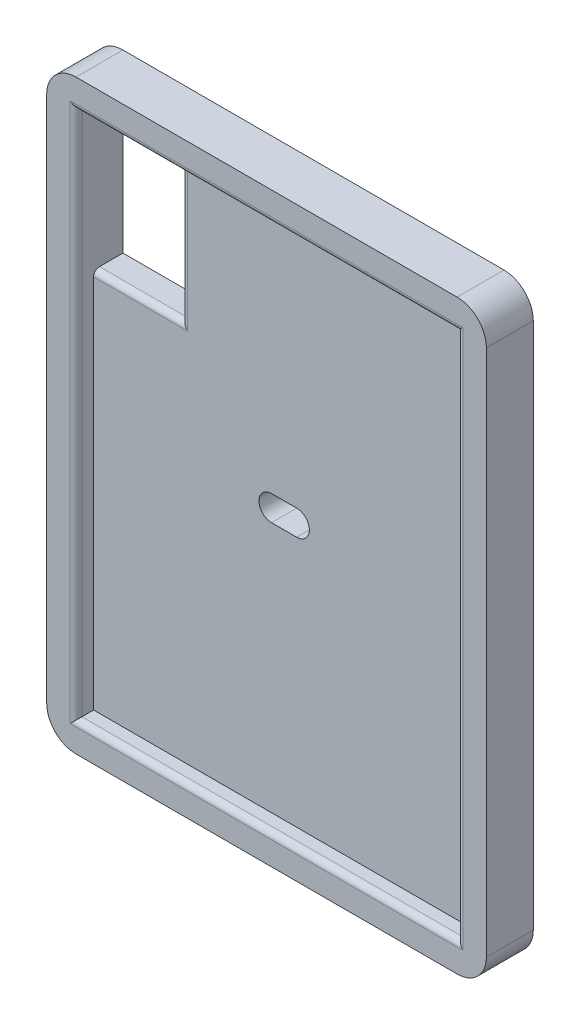
ISO-10303-21;
HEADER;
FILE_DESCRIPTION(('STEP AP214'),'2;1');
FILE_NAME('part.step','',(''),(''),'','','');
FILE_SCHEMA(('AUTOMOTIVE_DESIGN { 1 0 10303 214 1 1 1 1 }'));
ENDSEC;
DATA;
#1=APPLICATION_CONTEXT('core data for automotive mechanical design processes');
#2=APPLICATION_PROTOCOL_DEFINITION('international standard','automotive_design',2000,#1);
#3=PRODUCT_CONTEXT('',#1,'mechanical');
#4=PRODUCT('Part','Part','',(#3));
#5=PRODUCT_RELATED_PRODUCT_CATEGORY('part','',(#4));
#6=PRODUCT_DEFINITION_FORMATION('','',#4);
#7=PRODUCT_DEFINITION_CONTEXT('part definition',#1,'design');
#8=PRODUCT_DEFINITION('design','',#6,#7);
#9=PRODUCT_DEFINITION_SHAPE('','',#8);
#10=(LENGTH_UNIT() NAMED_UNIT(*) SI_UNIT(.MILLI.,.METRE.));
#11=(NAMED_UNIT(*) PLANE_ANGLE_UNIT() SI_UNIT($,.RADIAN.));
#12=(NAMED_UNIT(*) SI_UNIT($,.STERADIAN.) SOLID_ANGLE_UNIT());
#13=UNCERTAINTY_MEASURE_WITH_UNIT(LENGTH_MEASURE(1.E-05),#10,'distance_accuracy_value','');
#14=(GEOMETRIC_REPRESENTATION_CONTEXT(3) GLOBAL_UNCERTAINTY_ASSIGNED_CONTEXT((#13)) GLOBAL_UNIT_ASSIGNED_CONTEXT((#10,
#11,#12)) REPRESENTATION_CONTEXT('',''));
#15=CARTESIAN_POINT('',(0.,0.,0.));
#16=DIRECTION('',(0.,0.,1.));
#17=DIRECTION('',(1.,0.,0.));
#18=AXIS2_PLACEMENT_3D('',#15,#16,#17);
#19=CARTESIAN_POINT('',(0.,0.,5.));
#20=DIRECTION('',(0.,0.,-1.));
#21=DIRECTION('',(-1.,0.,0.));
#22=AXIS2_PLACEMENT_3D('',#19,#20,#21);
#23=PLANE('',#22);
#24=DIRECTION('',(1.,0.,0.));
#25=VECTOR('',#24,1.);
#26=CARTESIAN_POINT('',(-2.15,-2.15,5.));
#27=LINE('',#26,#25);
#28=CARTESIAN_POINT('',(-2.15,-2.15,5.));
#29=VERTEX_POINT('',#28);
#30=CARTESIAN_POINT('',(2.15,-2.15,5.));
#31=VERTEX_POINT('',#30);
#32=EDGE_CURVE('E231',#29,#31,#27,.T.);
#33=ORIENTED_EDGE('',*,*,#32,.F.);
#34=CARTESIAN_POINT('',(-2.15,0.,5.));
#35=DIRECTION('',(0.,0.,1.));
#36=DIRECTION('',(1.,0.,0.));
#37=AXIS2_PLACEMENT_3D('',#34,#35,#36);
#38=CIRCLE('',#37,2.15);
#39=CARTESIAN_POINT('',(-2.15,2.15,5.));
#40=VERTEX_POINT('',#39);
#41=EDGE_CURVE('E228',#40,#29,#38,.T.);
#42=ORIENTED_EDGE('',*,*,#41,.F.);
#43=DIRECTION('',(-1.,0.,0.));
#44=VECTOR('',#43,1.);
#45=CARTESIAN_POINT('',(-2.15,2.15,5.));
#46=LINE('',#45,#44);
#47=CARTESIAN_POINT('',(2.15,2.15,5.));
#48=VERTEX_POINT('',#47);
#49=EDGE_CURVE('E260',#48,#40,#46,.T.);
#50=ORIENTED_EDGE('',*,*,#49,.F.);
#51=CARTESIAN_POINT('',(2.15,0.,5.));
#52=DIRECTION('',(0.,0.,1.));
#53=DIRECTION('',(1.,0.,0.));
#54=AXIS2_PLACEMENT_3D('',#51,#52,#53);
#55=CIRCLE('',#54,2.15);
#56=EDGE_CURVE('E264',#31,#48,#55,.T.);
#57=ORIENTED_EDGE('',*,*,#56,.F.);
#58=EDGE_LOOP('',(#33,#42,#50,#57));
#59=FACE_BOUND('',#58,.T.);
#60=DIRECTION('',(-1.,0.,0.));
#61=VECTOR('',#60,1.);
#62=CARTESIAN_POINT('',(-32.5,45.,5.));
#63=LINE('',#62,#61);
#64=CARTESIAN_POINT('',(32.5,45.,5.));
#65=VERTEX_POINT('',#64);
#66=CARTESIAN_POINT('',(-16.5,45.,5.));
#67=VERTEX_POINT('',#66);
#68=EDGE_CURVE('E289',#65,#67,#63,.T.);
#69=ORIENTED_EDGE('',*,*,#68,.T.);
#70=DIRECTION('',(0.,1.,0.));
#71=VECTOR('',#70,1.);
#72=CARTESIAN_POINT('',(-16.5,0.,5.));
#73=LINE('',#72,#71);
#74=CARTESIAN_POINT('',(-16.5,19.,5.));
#75=VERTEX_POINT('',#74);
#76=EDGE_CURVE('E404',#67,#75,#73,.F.);
#77=ORIENTED_EDGE('',*,*,#76,.T.);
#78=DIRECTION('',(1.,0.,0.));
#79=VECTOR('',#78,1.);
#80=CARTESIAN_POINT('',(0.,19.,5.));
#81=LINE('',#80,#79);
#82=CARTESIAN_POINT('',(-32.5,19.,5.));
#83=VERTEX_POINT('',#82);
#84=EDGE_CURVE('E401',#75,#83,#81,.F.);
#85=ORIENTED_EDGE('',*,*,#84,.T.);
#86=DIRECTION('',(0.,-1.,0.));
#87=VECTOR('',#86,1.);
#88=CARTESIAN_POINT('',(-32.5,-45.,5.));
#89=LINE('',#88,#87);
#90=CARTESIAN_POINT('',(-32.5,-45.,5.));
#91=VERTEX_POINT('',#90);
#92=EDGE_CURVE('E293',#83,#91,#89,.T.);
#93=ORIENTED_EDGE('',*,*,#92,.T.);
#94=DIRECTION('',(1.,0.,0.));
#95=VECTOR('',#94,1.);
#96=CARTESIAN_POINT('',(-32.5,-45.,5.));
#97=LINE('',#96,#95);
#98=CARTESIAN_POINT('',(32.5,-45.,5.));
#99=VERTEX_POINT('',#98);
#100=EDGE_CURVE('E297',#91,#99,#97,.T.);
#101=ORIENTED_EDGE('',*,*,#100,.T.);
#102=DIRECTION('',(0.,1.,0.));
#103=VECTOR('',#102,1.);
#104=CARTESIAN_POINT('',(32.5,-45.,5.));
#105=LINE('',#104,#103);
#106=EDGE_CURVE('E242',#99,#65,#105,.T.);
#107=ORIENTED_EDGE('',*,*,#106,.T.);
#108=EDGE_LOOP('',(#69,#77,#85,#93,#101,#107));
#109=FACE_BOUND('',#108,.T.);
#110=ADVANCED_FACE('F45',(#59,#109),#23,.F.);
#111=CARTESIAN_POINT('',(37.5,50.,5.));
#112=DIRECTION('',(0.,-1.,0.));
#113=DIRECTION('',(0.,0.,-1.));
#114=AXIS2_PLACEMENT_3D('',#111,#112,#113);
#115=PLANE('',#114);
#116=DIRECTION('',(-1.,0.,0.));
#117=VECTOR('',#116,1.);
#118=CARTESIAN_POINT('',(37.5,50.,0.));
#119=LINE('',#118,#117);
#120=CARTESIAN_POINT('',(32.5,50.,0.));
#121=VERTEX_POINT('',#120);
#122=CARTESIAN_POINT('',(-32.5,50.,0.));
#123=VERTEX_POINT('',#122);
#124=EDGE_CURVE('E329',#121,#123,#119,.T.);
#125=ORIENTED_EDGE('',*,*,#124,.T.);
#126=DIRECTION('',(0.,0.,-1.));
#127=VECTOR('',#126,1.);
#128=CARTESIAN_POINT('',(-32.5,50.,5.));
#129=LINE('',#128,#127);
#130=CARTESIAN_POINT('',(-32.5,50.,8.));
#131=VERTEX_POINT('',#130);
#132=EDGE_CURVE('E368',#123,#131,#129,.F.);
#133=ORIENTED_EDGE('',*,*,#132,.T.);
#134=DIRECTION('',(-1.,0.,0.));
#135=VECTOR('',#134,1.);
#136=CARTESIAN_POINT('',(-37.5,50.,8.));
#137=LINE('',#136,#135);
#138=CARTESIAN_POINT('',(32.5,50.,8.));
#139=VERTEX_POINT('',#138);
#140=EDGE_CURVE('E325',#139,#131,#137,.T.);
#141=ORIENTED_EDGE('',*,*,#140,.F.);
#142=DIRECTION('',(0.,0.,-1.));
#143=VECTOR('',#142,1.);
#144=CARTESIAN_POINT('',(32.5,50.,5.));
#145=LINE('',#144,#143);
#146=EDGE_CURVE('E364',#139,#121,#145,.T.);
#147=ORIENTED_EDGE('',*,*,#146,.T.);
#148=EDGE_LOOP('',(#125,#133,#141,#147));
#149=FACE_BOUND('',#148,.T.);
#150=ADVANCED_FACE('F494',(#149),#115,.F.);
#151=CARTESIAN_POINT('',(-37.5,-50.,5.));
#152=DIRECTION('',(1.,0.,0.));
#153=DIRECTION('',(0.,0.,-1.));
#154=AXIS2_PLACEMENT_3D('',#151,#152,#153);
#155=PLANE('',#154);
#156=DIRECTION('',(0.,-1.,0.));
#157=VECTOR('',#156,1.);
#158=CARTESIAN_POINT('',(-37.5,-50.,8.));
#159=LINE('',#158,#157);
#160=CARTESIAN_POINT('',(-37.5,45.,8.));
#161=VERTEX_POINT('',#160);
#162=CARTESIAN_POINT('',(-37.5,-45.,8.));
#163=VERTEX_POINT('',#162);
#164=EDGE_CURVE('E313',#161,#163,#159,.T.);
#165=ORIENTED_EDGE('',*,*,#164,.F.);
#166=DIRECTION('',(0.,0.,-1.));
#167=VECTOR('',#166,1.);
#168=CARTESIAN_POINT('',(-37.5,45.,5.));
#169=LINE('',#168,#167);
#170=CARTESIAN_POINT('',(-37.5,45.,0.));
#171=VERTEX_POINT('',#170);
#172=EDGE_CURVE('E348',#161,#171,#169,.T.);
#173=ORIENTED_EDGE('',*,*,#172,.T.);
#174=DIRECTION('',(0.,-1.,0.));
#175=VECTOR('',#174,1.);
#176=CARTESIAN_POINT('',(-37.5,-50.,0.));
#177=LINE('',#176,#175);
#178=CARTESIAN_POINT('',(-37.5,-45.,0.));
#179=VERTEX_POINT('',#178);
#180=EDGE_CURVE('E333',#171,#179,#177,.T.);
#181=ORIENTED_EDGE('',*,*,#180,.T.);
#182=DIRECTION('',(0.,0.,-1.));
#183=VECTOR('',#182,1.);
#184=CARTESIAN_POINT('',(-37.5,-45.,5.));
#185=LINE('',#184,#183);
#186=EDGE_CURVE('E345',#179,#163,#185,.F.);
#187=ORIENTED_EDGE('',*,*,#186,.T.);
#188=EDGE_LOOP('',(#165,#173,#181,#187));
#189=FACE_BOUND('',#188,.T.);
#190=ADVANCED_FACE('F502',(#189),#155,.F.);
#191=CARTESIAN_POINT('',(37.5,-50.,5.));
#192=DIRECTION('',(0.,1.,0.));
#193=DIRECTION('',(0.,0.,1.));
#194=AXIS2_PLACEMENT_3D('',#191,#192,#193);
#195=PLANE('',#194);
#196=DIRECTION('',(1.,0.,0.));
#197=VECTOR('',#196,1.);
#198=CARTESIAN_POINT('',(37.5,-50.,0.));
#199=LINE('',#198,#197);
#200=CARTESIAN_POINT('',(-32.5,-50.,0.));
#201=VERTEX_POINT('',#200);
#202=CARTESIAN_POINT('',(32.5,-50.,0.));
#203=VERTEX_POINT('',#202);
#204=EDGE_CURVE('E337',#201,#203,#199,.T.);
#205=ORIENTED_EDGE('',*,*,#204,.T.);
#206=DIRECTION('',(0.,0.,-1.));
#207=VECTOR('',#206,1.);
#208=CARTESIAN_POINT('',(32.5,-50.,5.));
#209=LINE('',#208,#207);
#210=CARTESIAN_POINT('',(32.5,-50.,8.));
#211=VERTEX_POINT('',#210);
#212=EDGE_CURVE('E394',#203,#211,#209,.F.);
#213=ORIENTED_EDGE('',*,*,#212,.T.);
#214=DIRECTION('',(1.,0.,0.));
#215=VECTOR('',#214,1.);
#216=CARTESIAN_POINT('',(37.5,-50.,8.));
#217=LINE('',#216,#215);
#218=CARTESIAN_POINT('',(-32.5,-50.,8.));
#219=VERTEX_POINT('',#218);
#220=EDGE_CURVE('E317',#219,#211,#217,.T.);
#221=ORIENTED_EDGE('',*,*,#220,.F.);
#222=DIRECTION('',(0.,0.,-1.));
#223=VECTOR('',#222,1.);
#224=CARTESIAN_POINT('',(-32.5,-50.,5.));
#225=LINE('',#224,#223);
#226=EDGE_CURVE('E390',#219,#201,#225,.T.);
#227=ORIENTED_EDGE('',*,*,#226,.T.);
#228=EDGE_LOOP('',(#205,#213,#221,#227));
#229=FACE_BOUND('',#228,.T.);
#230=ADVANCED_FACE('F513',(#229),#195,.F.);
#231=CARTESIAN_POINT('',(37.5,-50.,5.));
#232=DIRECTION('',(-1.,0.,0.));
#233=DIRECTION('',(0.,0.,1.));
#234=AXIS2_PLACEMENT_3D('',#231,#232,#233);
#235=PLANE('',#234);
#236=DIRECTION('',(0.,1.,0.));
#237=VECTOR('',#236,1.);
#238=CARTESIAN_POINT('',(37.5,-50.,0.));
#239=LINE('',#238,#237);
#240=CARTESIAN_POINT('',(37.5,-45.,0.));
#241=VERTEX_POINT('',#240);
#242=CARTESIAN_POINT('',(37.5,45.,0.));
#243=VERTEX_POINT('',#242);
#244=EDGE_CURVE('E341',#241,#243,#239,.T.);
#245=ORIENTED_EDGE('',*,*,#244,.T.);
#246=DIRECTION('',(0.,0.,-1.));
#247=VECTOR('',#246,1.);
#248=CARTESIAN_POINT('',(37.5,45.,5.));
#249=LINE('',#248,#247);
#250=CARTESIAN_POINT('',(37.5,45.,8.));
#251=VERTEX_POINT('',#250);
#252=EDGE_CURVE('E387',#243,#251,#249,.F.);
#253=ORIENTED_EDGE('',*,*,#252,.T.);
#254=DIRECTION('',(0.,1.,0.));
#255=VECTOR('',#254,1.);
#256=CARTESIAN_POINT('',(37.5,50.,8.));
#257=LINE('',#256,#255);
#258=CARTESIAN_POINT('',(37.5,-45.,8.));
#259=VERTEX_POINT('',#258);
#260=EDGE_CURVE('E321',#259,#251,#257,.T.);
#261=ORIENTED_EDGE('',*,*,#260,.F.);
#262=DIRECTION('',(0.,0.,-1.));
#263=VECTOR('',#262,1.);
#264=CARTESIAN_POINT('',(37.5,-45.,5.));
#265=LINE('',#264,#263);
#266=EDGE_CURVE('E383',#259,#241,#265,.T.);
#267=ORIENTED_EDGE('',*,*,#266,.T.);
#268=EDGE_LOOP('',(#245,#253,#261,#267));
#269=FACE_BOUND('',#268,.T.);
#270=ADVANCED_FACE('F510',(#269),#235,.F.);
#271=CARTESIAN_POINT('',(0.,0.,0.));
#272=DIRECTION('',(0.,0.,-1.));
#273=DIRECTION('',(-1.,0.,0.));
#274=AXIS2_PLACEMENT_3D('',#271,#272,#273);
#275=PLANE('',#274);
#276=DIRECTION('',(0.,-1.,0.));
#277=VECTOR('',#276,1.);
#278=CARTESIAN_POINT('',(-32.5,45.,0.));
#279=LINE('',#278,#277);
#280=CARTESIAN_POINT('',(-32.5,45.,0.));
#281=VERTEX_POINT('',#280);
#282=CARTESIAN_POINT('',(-32.5,20.,0.));
#283=VERTEX_POINT('',#282);
#284=EDGE_CURVE('E204',#281,#283,#279,.T.);
#285=ORIENTED_EDGE('',*,*,#284,.T.);
#286=DIRECTION('',(1.,0.,0.));
#287=VECTOR('',#286,1.);
#288=CARTESIAN_POINT('',(-32.5,20.,0.));
#289=LINE('',#288,#287);
#290=CARTESIAN_POINT('',(-17.5,20.,0.));
#291=VERTEX_POINT('',#290);
#292=EDGE_CURVE('E216',#283,#291,#289,.T.);
#293=ORIENTED_EDGE('',*,*,#292,.T.);
#294=DIRECTION('',(0.,1.,0.));
#295=VECTOR('',#294,1.);
#296=CARTESIAN_POINT('',(-17.5,45.,0.));
#297=LINE('',#296,#295);
#298=CARTESIAN_POINT('',(-17.5,45.,0.));
#299=VERTEX_POINT('',#298);
#300=EDGE_CURVE('E222',#291,#299,#297,.T.);
#301=ORIENTED_EDGE('',*,*,#300,.T.);
#302=DIRECTION('',(-1.,0.,0.));
#303=VECTOR('',#302,1.);
#304=CARTESIAN_POINT('',(-32.5,45.,0.));
#305=LINE('',#304,#303);
#306=EDGE_CURVE('E212',#299,#281,#305,.T.);
#307=ORIENTED_EDGE('',*,*,#306,.T.);
#308=EDGE_LOOP('',(#285,#293,#301,#307));
#309=FACE_BOUND('',#308,.T.);
#310=CARTESIAN_POINT('',(-2.15,0.,0.));
#311=DIRECTION('',(0.,0.,1.));
#312=DIRECTION('',(1.,0.,0.));
#313=AXIS2_PLACEMENT_3D('',#310,#311,#312);
#314=CIRCLE('',#313,2.15);
#315=CARTESIAN_POINT('',(-2.15,2.15,0.));
#316=VERTEX_POINT('',#315);
#317=CARTESIAN_POINT('',(-2.15,-2.15,0.));
#318=VERTEX_POINT('',#317);
#319=EDGE_CURVE('E265',#316,#318,#314,.T.);
#320=ORIENTED_EDGE('',*,*,#319,.T.);
#321=DIRECTION('',(1.,0.,0.));
#322=VECTOR('',#321,1.);
#323=CARTESIAN_POINT('',(-2.15,-2.15,0.));
#324=LINE('',#323,#322);
#325=CARTESIAN_POINT('',(2.15,-2.15,0.));
#326=VERTEX_POINT('',#325);
#327=EDGE_CURVE('E279',#318,#326,#324,.T.);
#328=ORIENTED_EDGE('',*,*,#327,.T.);
#329=CARTESIAN_POINT('',(2.15,0.,0.));
#330=DIRECTION('',(0.,0.,1.));
#331=DIRECTION('',(1.,0.,0.));
#332=AXIS2_PLACEMENT_3D('',#329,#330,#331);
#333=CIRCLE('',#332,2.15);
#334=CARTESIAN_POINT('',(2.15,2.15,0.));
#335=VERTEX_POINT('',#334);
#336=EDGE_CURVE('E275',#326,#335,#333,.T.);
#337=ORIENTED_EDGE('',*,*,#336,.T.);
#338=DIRECTION('',(-1.,0.,0.));
#339=VECTOR('',#338,1.);
#340=CARTESIAN_POINT('',(-2.15,2.15,0.));
#341=LINE('',#340,#339);
#342=EDGE_CURVE('E249',#335,#316,#341,.T.);
#343=ORIENTED_EDGE('',*,*,#342,.T.);
#344=EDGE_LOOP('',(#320,#328,#337,#343));
#345=FACE_BOUND('',#344,.T.);
#346=ORIENTED_EDGE('',*,*,#180,.F.);
#347=CARTESIAN_POINT('',(-32.5,45.,0.));
#348=DIRECTION('',(0.,0.,-1.));
#349=DIRECTION('',(-1.,0.,0.));
#350=AXIS2_PLACEMENT_3D('',#347,#348,#349);
#351=CIRCLE('',#350,5.);
#352=EDGE_CURVE('E361',#171,#123,#351,.T.);
#353=ORIENTED_EDGE('',*,*,#352,.T.);
#354=ORIENTED_EDGE('',*,*,#124,.F.);
#355=CARTESIAN_POINT('',(32.5,45.,0.));
#356=DIRECTION('',(0.,0.,-1.));
#357=DIRECTION('',(-1.,0.,0.));
#358=AXIS2_PLACEMENT_3D('',#355,#356,#357);
#359=CIRCLE('',#358,5.);
#360=EDGE_CURVE('E358',#121,#243,#359,.T.);
#361=ORIENTED_EDGE('',*,*,#360,.T.);
#362=ORIENTED_EDGE('',*,*,#244,.F.);
#363=CARTESIAN_POINT('',(32.5,-45.,0.));
#364=DIRECTION('',(0.,0.,-1.));
#365=DIRECTION('',(-1.,0.,0.));
#366=AXIS2_PLACEMENT_3D('',#363,#364,#365);
#367=CIRCLE('',#366,5.);
#368=EDGE_CURVE('E355',#241,#203,#367,.T.);
#369=ORIENTED_EDGE('',*,*,#368,.T.);
#370=ORIENTED_EDGE('',*,*,#204,.F.);
#371=CARTESIAN_POINT('',(-32.5,-45.,0.));
#372=DIRECTION('',(0.,0.,-1.));
#373=DIRECTION('',(-1.,0.,0.));
#374=AXIS2_PLACEMENT_3D('',#371,#372,#373);
#375=CIRCLE('',#374,5.);
#376=EDGE_CURVE('E352',#201,#179,#375,.T.);
#377=ORIENTED_EDGE('',*,*,#376,.T.);
#378=EDGE_LOOP('',(#346,#353,#354,#361,#362,#369,#370,#377));
#379=FACE_BOUND('',#378,.T.);
#380=ADVANCED_FACE('F224',(#309,#345,#379),#275,.T.);
#381=CARTESIAN_POINT('',(0.,0.,8.));
#382=DIRECTION('',(0.,0.,-1.));
#383=DIRECTION('',(-1.,0.,0.));
#384=AXIS2_PLACEMENT_3D('',#381,#382,#383);
#385=PLANE('',#384);
#386=DIRECTION('',(0.,1.,0.));
#387=VECTOR('',#386,1.);
#388=CARTESIAN_POINT('',(33.5,-45.,8.));
#389=LINE('',#388,#387);
#390=CARTESIAN_POINT('',(33.5,46.,8.));
#391=VERTEX_POINT('',#390);
#392=CARTESIAN_POINT('',(33.5,-46.,8.));
#393=VERTEX_POINT('',#392);
#394=EDGE_CURVE('E414',#391,#393,#389,.F.);
#395=ORIENTED_EDGE('',*,*,#394,.T.);
#396=DIRECTION('',(1.,0.,0.));
#397=VECTOR('',#396,1.);
#398=CARTESIAN_POINT('',(-32.5,-46.,8.));
#399=LINE('',#398,#397);
#400=CARTESIAN_POINT('',(-33.5,-46.,8.));
#401=VERTEX_POINT('',#400);
#402=EDGE_CURVE('E423',#393,#401,#399,.F.);
#403=ORIENTED_EDGE('',*,*,#402,.T.);
#404=DIRECTION('',(0.,-1.,0.));
#405=VECTOR('',#404,1.);
#406=CARTESIAN_POINT('',(-33.5,45.,8.));
#407=LINE('',#406,#405);
#408=CARTESIAN_POINT('',(-33.5,46.,8.));
#409=VERTEX_POINT('',#408);
#410=EDGE_CURVE('E420',#401,#409,#407,.F.);
#411=ORIENTED_EDGE('',*,*,#410,.T.);
#412=DIRECTION('',(-1.,0.,0.));
#413=VECTOR('',#412,1.);
#414=CARTESIAN_POINT('',(32.5,46.,8.));
#415=LINE('',#414,#413);
#416=EDGE_CURVE('E417',#409,#391,#415,.F.);
#417=ORIENTED_EDGE('',*,*,#416,.T.);
#418=EDGE_LOOP('',(#395,#403,#411,#417));
#419=FACE_BOUND('',#418,.T.);
#420=ORIENTED_EDGE('',*,*,#140,.T.);
#421=CARTESIAN_POINT('',(-32.5,45.,8.));
#422=DIRECTION('',(0.,0.,-1.));
#423=DIRECTION('',(-1.,0.,0.));
#424=AXIS2_PLACEMENT_3D('',#421,#422,#423);
#425=CIRCLE('',#424,5.);
#426=EDGE_CURVE('E380',#131,#161,#425,.F.);
#427=ORIENTED_EDGE('',*,*,#426,.T.);
#428=ORIENTED_EDGE('',*,*,#164,.T.);
#429=CARTESIAN_POINT('',(-32.5,-45.,8.));
#430=DIRECTION('',(0.,0.,-1.));
#431=DIRECTION('',(-1.,0.,0.));
#432=AXIS2_PLACEMENT_3D('',#429,#430,#431);
#433=CIRCLE('',#432,5.);
#434=EDGE_CURVE('E371',#163,#219,#433,.F.);
#435=ORIENTED_EDGE('',*,*,#434,.T.);
#436=ORIENTED_EDGE('',*,*,#220,.T.);
#437=CARTESIAN_POINT('',(32.5,-45.,8.));
#438=DIRECTION('',(0.,0.,-1.));
#439=DIRECTION('',(-1.,0.,0.));
#440=AXIS2_PLACEMENT_3D('',#437,#438,#439);
#441=CIRCLE('',#440,5.);
#442=EDGE_CURVE('E374',#211,#259,#441,.F.);
#443=ORIENTED_EDGE('',*,*,#442,.T.);
#444=ORIENTED_EDGE('',*,*,#260,.T.);
#445=CARTESIAN_POINT('',(32.5,45.,8.));
#446=DIRECTION('',(0.,0.,-1.));
#447=DIRECTION('',(-1.,0.,0.));
#448=AXIS2_PLACEMENT_3D('',#445,#446,#447);
#449=CIRCLE('',#448,5.);
#450=EDGE_CURVE('E377',#251,#139,#449,.F.);
#451=ORIENTED_EDGE('',*,*,#450,.T.);
#452=EDGE_LOOP('',(#420,#427,#428,#435,#436,#443,#444,#451));
#453=FACE_BOUND('',#452,.T.);
#454=ADVANCED_FACE('F461',(#419,#453),#385,.F.);
#455=CARTESIAN_POINT('',(32.5,-45.,8.));
#456=DIRECTION('',(-1.,0.,0.));
#457=DIRECTION('',(0.,0.,1.));
#458=AXIS2_PLACEMENT_3D('',#455,#456,#457);
#459=PLANE('',#458);
#460=DIRECTION('',(0.,0.,-1.));
#461=VECTOR('',#460,1.);
#462=CARTESIAN_POINT('',(32.5,-45.,8.));
#463=LINE('',#462,#461);
#464=CARTESIAN_POINT('',(32.5,-45.,7.));
#465=VERTEX_POINT('',#464);
#466=EDGE_CURVE('E301',#465,#99,#463,.T.);
#467=ORIENTED_EDGE('',*,*,#466,.F.);
#468=DIRECTION('',(0.,1.,0.));
#469=VECTOR('',#468,1.);
#470=CARTESIAN_POINT('',(32.5,45.,7.));
#471=LINE('',#470,#469);
#472=CARTESIAN_POINT('',(32.5,45.,7.));
#473=VERTEX_POINT('',#472);
#474=EDGE_CURVE('E63',#465,#473,#471,.T.);
#475=ORIENTED_EDGE('',*,*,#474,.T.);
#476=DIRECTION('',(0.,0.,-1.));
#477=VECTOR('',#476,1.);
#478=CARTESIAN_POINT('',(32.5,45.,8.));
#479=LINE('',#478,#477);
#480=EDGE_CURVE('E310',#473,#65,#479,.T.);
#481=ORIENTED_EDGE('',*,*,#480,.T.);
#482=ORIENTED_EDGE('',*,*,#106,.F.);
#483=EDGE_LOOP('',(#467,#475,#481,#482));
#484=FACE_BOUND('',#483,.T.);
#485=ADVANCED_FACE('F474',(#484),#459,.T.);
#486=CARTESIAN_POINT('',(-32.5,45.,8.));
#487=DIRECTION('',(0.,-1.,0.));
#488=DIRECTION('',(0.,0.,-1.));
#489=AXIS2_PLACEMENT_3D('',#486,#487,#488);
#490=PLANE('',#489);
#491=ORIENTED_EDGE('',*,*,#480,.F.);
#492=DIRECTION('',(-1.,0.,0.));
#493=VECTOR('',#492,1.);
#494=CARTESIAN_POINT('',(-32.5,45.,7.));
#495=LINE('',#494,#493);
#496=CARTESIAN_POINT('',(-32.5,45.,7.));
#497=VERTEX_POINT('',#496);
#498=EDGE_CURVE('E70',#473,#497,#495,.T.);
#499=ORIENTED_EDGE('',*,*,#498,.T.);
#500=DIRECTION('',(0.,0.,-1.));
#501=VECTOR('',#500,1.);
#502=CARTESIAN_POINT('',(-32.5,45.,8.));
#503=LINE('',#502,#501);
#504=EDGE_CURVE('E307',#497,#281,#503,.T.);
#505=ORIENTED_EDGE('',*,*,#504,.T.);
#506=ORIENTED_EDGE('',*,*,#306,.F.);
#507=DIRECTION('',(0.,0.,1.));
#508=VECTOR('',#507,1.);
#509=CARTESIAN_POINT('',(-17.5,45.,0.));
#510=LINE('',#509,#508);
#511=CARTESIAN_POINT('',(-17.5,45.,4.));
#512=VERTEX_POINT('',#511);
#513=EDGE_CURVE('E238',#299,#512,#510,.T.);
#514=ORIENTED_EDGE('',*,*,#513,.T.);
#515=CARTESIAN_POINT('',(-16.5,45.,4.));
#516=DIRECTION('',(0.,-1.,0.));
#517=DIRECTION('',(0.,0.,-1.));
#518=AXIS2_PLACEMENT_3D('',#515,#516,#517);
#519=CIRCLE('',#518,1.);
#520=EDGE_CURVE('E55',#512,#67,#519,.F.);
#521=ORIENTED_EDGE('',*,*,#520,.T.);
#522=ORIENTED_EDGE('',*,*,#68,.F.);
#523=EDGE_LOOP('',(#491,#499,#505,#506,#514,#521,#522));
#524=FACE_BOUND('',#523,.T.);
#525=ADVANCED_FACE('F484',(#524),#490,.T.);
#526=CARTESIAN_POINT('',(-32.5,-45.,8.));
#527=DIRECTION('',(1.,0.,0.));
#528=DIRECTION('',(0.,0.,-1.));
#529=AXIS2_PLACEMENT_3D('',#526,#527,#528);
#530=PLANE('',#529);
#531=ORIENTED_EDGE('',*,*,#504,.F.);
#532=DIRECTION('',(0.,-1.,0.));
#533=VECTOR('',#532,1.);
#534=CARTESIAN_POINT('',(-32.5,-45.,7.));
#535=LINE('',#534,#533);
#536=CARTESIAN_POINT('',(-32.5,-45.,7.));
#537=VERTEX_POINT('',#536);
#538=EDGE_CURVE('E427',#497,#537,#535,.T.);
#539=ORIENTED_EDGE('',*,*,#538,.T.);
#540=DIRECTION('',(0.,0.,-1.));
#541=VECTOR('',#540,1.);
#542=CARTESIAN_POINT('',(-32.5,-45.,8.));
#543=LINE('',#542,#541);
#544=EDGE_CURVE('E304',#537,#91,#543,.T.);
#545=ORIENTED_EDGE('',*,*,#544,.T.);
#546=ORIENTED_EDGE('',*,*,#92,.F.);
#547=CARTESIAN_POINT('',(-32.5,19.,4.));
#548=DIRECTION('',(1.,0.,0.));
#549=DIRECTION('',(0.,0.,-1.));
#550=AXIS2_PLACEMENT_3D('',#547,#548,#549);
#551=CIRCLE('',#550,1.);
#552=CARTESIAN_POINT('',(-32.5,20.,4.));
#553=VERTEX_POINT('',#552);
#554=EDGE_CURVE('E11',#83,#553,#551,.F.);
#555=ORIENTED_EDGE('',*,*,#554,.T.);
#556=DIRECTION('',(0.,0.,1.));
#557=VECTOR('',#556,1.);
#558=CARTESIAN_POINT('',(-32.5,20.,0.));
#559=LINE('',#558,#557);
#560=EDGE_CURVE('E200',#283,#553,#559,.T.);
#561=ORIENTED_EDGE('',*,*,#560,.F.);
#562=ORIENTED_EDGE('',*,*,#284,.F.);
#563=EDGE_LOOP('',(#531,#539,#545,#546,#555,#561,#562));
#564=FACE_BOUND('',#563,.T.);
#565=ADVANCED_FACE('F202',(#564),#530,.T.);
#566=CARTESIAN_POINT('',(-32.5,-45.,8.));
#567=DIRECTION('',(0.,1.,0.));
#568=DIRECTION('',(0.,0.,1.));
#569=AXIS2_PLACEMENT_3D('',#566,#567,#568);
#570=PLANE('',#569);
#571=ORIENTED_EDGE('',*,*,#544,.F.);
#572=DIRECTION('',(1.,0.,0.));
#573=VECTOR('',#572,1.);
#574=CARTESIAN_POINT('',(32.5,-45.,7.));
#575=LINE('',#574,#573);
#576=EDGE_CURVE('E410',#537,#465,#575,.T.);
#577=ORIENTED_EDGE('',*,*,#576,.T.);
#578=ORIENTED_EDGE('',*,*,#466,.T.);
#579=ORIENTED_EDGE('',*,*,#100,.F.);
#580=EDGE_LOOP('',(#571,#577,#578,#579));
#581=FACE_BOUND('',#580,.T.);
#582=ADVANCED_FACE('F471',(#581),#570,.T.);
#583=CARTESIAN_POINT('',(-2.15,0.,0.));
#584=DIRECTION('',(0.,0.,1.));
#585=DIRECTION('',(1.,0.,0.));
#586=AXIS2_PLACEMENT_3D('',#583,#584,#585);
#587=CYLINDRICAL_SURFACE('',#586,2.15);
#588=ORIENTED_EDGE('',*,*,#41,.T.);
#589=DIRECTION('',(0.,0.,1.));
#590=VECTOR('',#589,1.);
#591=CARTESIAN_POINT('',(-2.15,-2.15,0.));
#592=LINE('',#591,#590);
#593=EDGE_CURVE('E245',#318,#29,#592,.T.);
#594=ORIENTED_EDGE('',*,*,#593,.F.);
#595=ORIENTED_EDGE('',*,*,#319,.F.);
#596=DIRECTION('',(0.,0.,1.));
#597=VECTOR('',#596,1.);
#598=CARTESIAN_POINT('',(-2.15,2.15,0.));
#599=LINE('',#598,#597);
#600=EDGE_CURVE('E256',#316,#40,#599,.T.);
#601=ORIENTED_EDGE('',*,*,#600,.T.);
#602=EDGE_LOOP('',(#588,#594,#595,#601));
#603=FACE_BOUND('',#602,.T.);
#604=ADVANCED_FACE('F585',(#603),#587,.F.);
#605=CARTESIAN_POINT('',(-2.15,2.15,0.));
#606=DIRECTION('',(0.,1.,0.));
#607=DIRECTION('',(-1.,0.,0.));
#608=AXIS2_PLACEMENT_3D('',#605,#606,#607);
#609=PLANE('',#608);
#610=ORIENTED_EDGE('',*,*,#49,.T.);
#611=ORIENTED_EDGE('',*,*,#600,.F.);
#612=ORIENTED_EDGE('',*,*,#342,.F.);
#613=DIRECTION('',(0.,0.,1.));
#614=VECTOR('',#613,1.);
#615=CARTESIAN_POINT('',(2.15,2.15,0.));
#616=LINE('',#615,#614);
#617=EDGE_CURVE('E253',#335,#48,#616,.T.);
#618=ORIENTED_EDGE('',*,*,#617,.T.);
#619=EDGE_LOOP('',(#610,#611,#612,#618));
#620=FACE_BOUND('',#619,.T.);
#621=ADVANCED_FACE('F608',(#620),#609,.F.);
#622=CARTESIAN_POINT('',(2.15,0.,0.));
#623=DIRECTION('',(0.,0.,1.));
#624=DIRECTION('',(1.,0.,0.));
#625=AXIS2_PLACEMENT_3D('',#622,#623,#624);
#626=CYLINDRICAL_SURFACE('',#625,2.15);
#627=ORIENTED_EDGE('',*,*,#56,.T.);
#628=ORIENTED_EDGE('',*,*,#617,.F.);
#629=ORIENTED_EDGE('',*,*,#336,.F.);
#630=DIRECTION('',(0.,0.,1.));
#631=VECTOR('',#630,1.);
#632=CARTESIAN_POINT('',(2.15,-2.15,0.));
#633=LINE('',#632,#631);
#634=EDGE_CURVE('E250',#326,#31,#633,.T.);
#635=ORIENTED_EDGE('',*,*,#634,.T.);
#636=EDGE_LOOP('',(#627,#628,#629,#635));
#637=FACE_BOUND('',#636,.T.);
#638=ADVANCED_FACE('F618',(#637),#626,.F.);
#639=CARTESIAN_POINT('',(-2.15,-2.15,0.));
#640=DIRECTION('',(0.,-1.,0.));
#641=DIRECTION('',(1.,0.,0.));
#642=AXIS2_PLACEMENT_3D('',#639,#640,#641);
#643=PLANE('',#642);
#644=ORIENTED_EDGE('',*,*,#32,.T.);
#645=ORIENTED_EDGE('',*,*,#634,.F.);
#646=ORIENTED_EDGE('',*,*,#327,.F.);
#647=ORIENTED_EDGE('',*,*,#593,.T.);
#648=EDGE_LOOP('',(#644,#645,#646,#647));
#649=FACE_BOUND('',#648,.T.);
#650=ADVANCED_FACE('F577',(#649),#643,.F.);
#651=CARTESIAN_POINT('',(-17.5,45.,0.));
#652=DIRECTION('',(1.,0.,0.));
#653=DIRECTION('',(0.,0.,-1.));
#654=AXIS2_PLACEMENT_3D('',#651,#652,#653);
#655=PLANE('',#654);
#656=DIRECTION('',(0.,0.,1.));
#657=VECTOR('',#656,1.);
#658=CARTESIAN_POINT('',(-17.5,20.,0.));
#659=LINE('',#658,#657);
#660=CARTESIAN_POINT('',(-17.5,20.,4.));
#661=VERTEX_POINT('',#660);
#662=EDGE_CURVE('E211',#291,#661,#659,.T.);
#663=ORIENTED_EDGE('',*,*,#662,.T.);
#664=DIRECTION('',(0.,1.,0.));
#665=VECTOR('',#664,1.);
#666=CARTESIAN_POINT('',(-17.5,45.,4.));
#667=LINE('',#666,#665);
#668=EDGE_CURVE('E397',#661,#512,#667,.T.);
#669=ORIENTED_EDGE('',*,*,#668,.T.);
#670=ORIENTED_EDGE('',*,*,#513,.F.);
#671=ORIENTED_EDGE('',*,*,#300,.F.);
#672=EDGE_LOOP('',(#663,#669,#670,#671));
#673=FACE_BOUND('',#672,.T.);
#674=ADVANCED_FACE('F483',(#673),#655,.F.);
#675=CARTESIAN_POINT('',(-32.5,20.,0.));
#676=DIRECTION('',(0.,-1.,0.));
#677=DIRECTION('',(0.,0.,-1.));
#678=AXIS2_PLACEMENT_3D('',#675,#676,#677);
#679=PLANE('',#678);
#680=ORIENTED_EDGE('',*,*,#560,.T.);
#681=DIRECTION('',(1.,0.,0.));
#682=VECTOR('',#681,1.);
#683=CARTESIAN_POINT('',(-32.5,20.,4.));
#684=LINE('',#683,#682);
#685=EDGE_CURVE('E407',#553,#661,#684,.T.);
#686=ORIENTED_EDGE('',*,*,#685,.T.);
#687=ORIENTED_EDGE('',*,*,#662,.F.);
#688=ORIENTED_EDGE('',*,*,#292,.F.);
#689=EDGE_LOOP('',(#680,#686,#687,#688));
#690=FACE_BOUND('',#689,.T.);
#691=ADVANCED_FACE('F217',(#690),#679,.F.);
#692=CARTESIAN_POINT('',(-32.5,45.,5.));
#693=DIRECTION('',(0.,0.,-1.));
#694=DIRECTION('',(-1.,0.,0.));
#695=AXIS2_PLACEMENT_3D('',#692,#693,#694);
#696=CYLINDRICAL_SURFACE('',#695,5.);
#697=ORIENTED_EDGE('',*,*,#426,.F.);
#698=ORIENTED_EDGE('',*,*,#132,.F.);
#699=ORIENTED_EDGE('',*,*,#352,.F.);
#700=ORIENTED_EDGE('',*,*,#172,.F.);
#701=EDGE_LOOP('',(#697,#698,#699,#700));
#702=FACE_BOUND('',#701,.T.);
#703=ADVANCED_FACE('F521',(#702),#696,.T.);
#704=CARTESIAN_POINT('',(32.5,45.,5.));
#705=DIRECTION('',(0.,0.,-1.));
#706=DIRECTION('',(-1.,0.,0.));
#707=AXIS2_PLACEMENT_3D('',#704,#705,#706);
#708=CYLINDRICAL_SURFACE('',#707,5.);
#709=ORIENTED_EDGE('',*,*,#450,.F.);
#710=ORIENTED_EDGE('',*,*,#252,.F.);
#711=ORIENTED_EDGE('',*,*,#360,.F.);
#712=ORIENTED_EDGE('',*,*,#146,.F.);
#713=EDGE_LOOP('',(#709,#710,#711,#712));
#714=FACE_BOUND('',#713,.T.);
#715=ADVANCED_FACE('F524',(#714),#708,.T.);
#716=CARTESIAN_POINT('',(32.5,-45.,5.));
#717=DIRECTION('',(0.,0.,-1.));
#718=DIRECTION('',(-1.,0.,0.));
#719=AXIS2_PLACEMENT_3D('',#716,#717,#718);
#720=CYLINDRICAL_SURFACE('',#719,5.);
#721=ORIENTED_EDGE('',*,*,#442,.F.);
#722=ORIENTED_EDGE('',*,*,#212,.F.);
#723=ORIENTED_EDGE('',*,*,#368,.F.);
#724=ORIENTED_EDGE('',*,*,#266,.F.);
#725=EDGE_LOOP('',(#721,#722,#723,#724));
#726=FACE_BOUND('',#725,.T.);
#727=ADVANCED_FACE('F528',(#726),#720,.T.);
#728=CARTESIAN_POINT('',(-32.5,-45.,5.));
#729=DIRECTION('',(0.,0.,-1.));
#730=DIRECTION('',(-1.,0.,0.));
#731=AXIS2_PLACEMENT_3D('',#728,#729,#730);
#732=CYLINDRICAL_SURFACE('',#731,5.);
#733=ORIENTED_EDGE('',*,*,#434,.F.);
#734=ORIENTED_EDGE('',*,*,#186,.F.);
#735=ORIENTED_EDGE('',*,*,#376,.F.);
#736=ORIENTED_EDGE('',*,*,#226,.F.);
#737=EDGE_LOOP('',(#733,#734,#735,#736));
#738=FACE_BOUND('',#737,.T.);
#739=ADVANCED_FACE('F532',(#738),#732,.T.);
#740=CARTESIAN_POINT('',(-32.5,19.,4.));
#741=DIRECTION('',(1.,0.,0.));
#742=DIRECTION('',(0.,0.,-1.));
#743=AXIS2_PLACEMENT_3D('',#740,#741,#742);
#744=CYLINDRICAL_SURFACE('',#743,1.);
#745=ORIENTED_EDGE('',*,*,#554,.F.);
#746=ORIENTED_EDGE('',*,*,#84,.F.);
#747=CARTESIAN_POINT('',(-16.5,19.,4.));
#748=DIRECTION('',(0.707106781186547,0.707106781186547,0.));
#749=DIRECTION('',(-0.707106781186547,0.707106781186547,0.));
#750=AXIS2_PLACEMENT_3D('',#747,#748,#749);
#751=ELLIPSE('',#750,1.41421356237309,1.);
#752=EDGE_CURVE('E259',#661,#75,#751,.T.);
#753=ORIENTED_EDGE('',*,*,#752,.F.);
#754=ORIENTED_EDGE('',*,*,#685,.F.);
#755=EDGE_LOOP('',(#745,#746,#753,#754));
#756=FACE_BOUND('',#755,.T.);
#757=ADVANCED_FACE('F479',(#756),#744,.T.);
#758=CARTESIAN_POINT('',(-16.5,45.,4.));
#759=DIRECTION('',(0.,1.,0.));
#760=DIRECTION('',(0.,0.,1.));
#761=AXIS2_PLACEMENT_3D('',#758,#759,#760);
#762=CYLINDRICAL_SURFACE('',#761,1.);
#763=ORIENTED_EDGE('',*,*,#752,.T.);
#764=ORIENTED_EDGE('',*,*,#76,.F.);
#765=ORIENTED_EDGE('',*,*,#520,.F.);
#766=ORIENTED_EDGE('',*,*,#668,.F.);
#767=EDGE_LOOP('',(#763,#764,#765,#766));
#768=FACE_BOUND('',#767,.T.);
#769=ADVANCED_FACE('F536',(#768),#762,.T.);
#770=CARTESIAN_POINT('',(-32.5,46.,7.));
#771=DIRECTION('',(1.,0.,0.));
#772=DIRECTION('',(0.,0.,-1.));
#773=AXIS2_PLACEMENT_3D('',#770,#771,#772);
#774=CYLINDRICAL_SURFACE('',#773,1.);
#775=CARTESIAN_POINT('',(33.5,46.,7.));
#776=DIRECTION('',(0.707106781186547,-0.707106781186547,0.));
#777=DIRECTION('',(0.707106781186547,0.707106781186547,0.));
#778=AXIS2_PLACEMENT_3D('',#775,#776,#777);
#779=ELLIPSE('',#778,1.41421356237309,1.);
#780=EDGE_CURVE('E444',#391,#473,#779,.T.);
#781=ORIENTED_EDGE('',*,*,#780,.F.);
#782=ORIENTED_EDGE('',*,*,#416,.F.);
#783=CARTESIAN_POINT('',(-33.5,46.,7.));
#784=DIRECTION('',(0.707106781186547,0.707106781186547,0.));
#785=DIRECTION('',(-0.707106781186547,0.707106781186547,0.));
#786=AXIS2_PLACEMENT_3D('',#783,#784,#785);
#787=ELLIPSE('',#786,1.41421356237309,1.);
#788=EDGE_CURVE('E49',#497,#409,#787,.F.);
#789=ORIENTED_EDGE('',*,*,#788,.F.);
#790=ORIENTED_EDGE('',*,*,#498,.F.);
#791=EDGE_LOOP('',(#781,#782,#789,#790));
#792=FACE_BOUND('',#791,.T.);
#793=ADVANCED_FACE('F47',(#792),#774,.T.);
#794=CARTESIAN_POINT('',(-33.5,-45.,7.));
#795=DIRECTION('',(0.,1.,0.));
#796=DIRECTION('',(0.,0.,1.));
#797=AXIS2_PLACEMENT_3D('',#794,#795,#796);
#798=CYLINDRICAL_SURFACE('',#797,1.);
#799=ORIENTED_EDGE('',*,*,#788,.T.);
#800=ORIENTED_EDGE('',*,*,#410,.F.);
#801=CARTESIAN_POINT('',(-33.5,-46.,7.));
#802=DIRECTION('',(-0.707106781186547,0.707106781186547,0.));
#803=DIRECTION('',(-0.707106781186547,-0.707106781186547,0.));
#804=AXIS2_PLACEMENT_3D('',#801,#802,#803);
#805=ELLIPSE('',#804,1.41421356237309,1.);
#806=EDGE_CURVE('E442',#537,#401,#805,.F.);
#807=ORIENTED_EDGE('',*,*,#806,.F.);
#808=ORIENTED_EDGE('',*,*,#538,.F.);
#809=EDGE_LOOP('',(#799,#800,#807,#808));
#810=FACE_BOUND('',#809,.T.);
#811=ADVANCED_FACE('F456',(#810),#798,.T.);
#812=CARTESIAN_POINT('',(33.5,-45.,7.));
#813=DIRECTION('',(0.,-1.,0.));
#814=DIRECTION('',(0.,0.,-1.));
#815=AXIS2_PLACEMENT_3D('',#812,#813,#814);
#816=CYLINDRICAL_SURFACE('',#815,1.);
#817=ORIENTED_EDGE('',*,*,#780,.T.);
#818=ORIENTED_EDGE('',*,*,#474,.F.);
#819=CARTESIAN_POINT('',(33.5,-46.,7.));
#820=DIRECTION('',(-0.707106781186547,-0.707106781186547,0.));
#821=DIRECTION('',(-0.707106781186547,0.707106781186547,0.));
#822=AXIS2_PLACEMENT_3D('',#819,#820,#821);
#823=ELLIPSE('',#822,1.41421356237309,1.);
#824=EDGE_CURVE('E439',#393,#465,#823,.T.);
#825=ORIENTED_EDGE('',*,*,#824,.F.);
#826=ORIENTED_EDGE('',*,*,#394,.F.);
#827=EDGE_LOOP('',(#817,#818,#825,#826));
#828=FACE_BOUND('',#827,.T.);
#829=ADVANCED_FACE('F468',(#828),#816,.T.);
#830=CARTESIAN_POINT('',(-32.5,-46.,7.));
#831=DIRECTION('',(-1.,0.,0.));
#832=DIRECTION('',(0.,0.,1.));
#833=AXIS2_PLACEMENT_3D('',#830,#831,#832);
#834=CYLINDRICAL_SURFACE('',#833,1.);
#835=ORIENTED_EDGE('',*,*,#806,.T.);
#836=ORIENTED_EDGE('',*,*,#402,.F.);
#837=ORIENTED_EDGE('',*,*,#824,.T.);
#838=ORIENTED_EDGE('',*,*,#576,.F.);
#839=EDGE_LOOP('',(#835,#836,#837,#838));
#840=FACE_BOUND('',#839,.T.);
#841=ADVANCED_FACE('F466',(#840),#834,.T.);
#842=CLOSED_SHELL('',(#110,#150,#190,#230,#270,#380,#454,#485,#525,#565,#582,#604,#621,#638,
#650,#674,#691,#703,#715,#727,#739,#757,#769,#793,#811,#829,#841));
#843=MANIFOLD_SOLID_BREP('B2',#842);
#844=ADVANCED_BREP_SHAPE_REPRESENTATION('',(#18,#843),#14);
#845=SHAPE_DEFINITION_REPRESENTATION(#9,#844);
ENDSEC;
END-ISO-10303-21;
